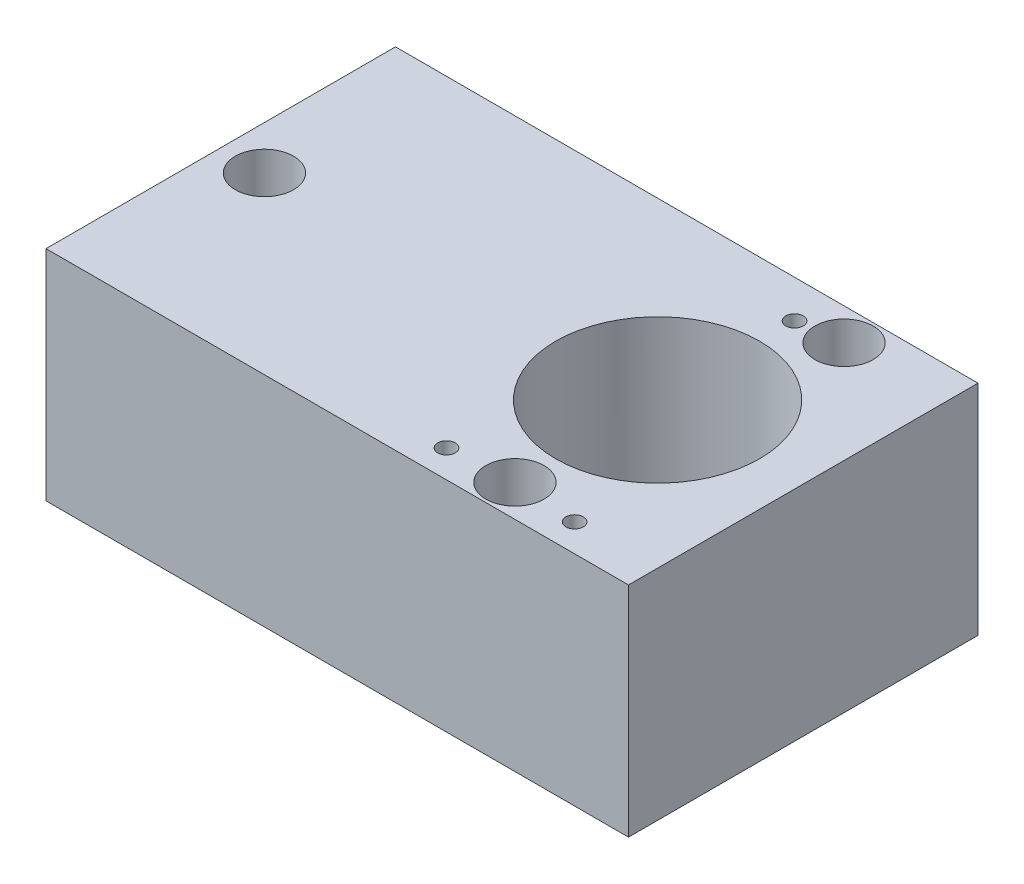
ISO-10303-21;
HEADER;
FILE_DESCRIPTION(('STEP AP214'),'2;1');
FILE_NAME('part.step','',(''),(''),'','','');
FILE_SCHEMA(('AUTOMOTIVE_DESIGN { 1 0 10303 214 1 1 1 1 }'));
ENDSEC;
DATA;
#1=APPLICATION_CONTEXT('core data for automotive mechanical design processes');
#2=APPLICATION_PROTOCOL_DEFINITION('international standard','automotive_design',2000,#1);
#3=PRODUCT_CONTEXT('',#1,'mechanical');
#4=PRODUCT('Part','Part','',(#3));
#5=PRODUCT_RELATED_PRODUCT_CATEGORY('part','',(#4));
#6=PRODUCT_DEFINITION_FORMATION('','',#4);
#7=PRODUCT_DEFINITION_CONTEXT('part definition',#1,'design');
#8=PRODUCT_DEFINITION('design','',#6,#7);
#9=PRODUCT_DEFINITION_SHAPE('','',#8);
#10=(LENGTH_UNIT() NAMED_UNIT(*) SI_UNIT(.MILLI.,.METRE.));
#11=(NAMED_UNIT(*) PLANE_ANGLE_UNIT() SI_UNIT($,.RADIAN.));
#12=(NAMED_UNIT(*) SI_UNIT($,.STERADIAN.) SOLID_ANGLE_UNIT());
#13=UNCERTAINTY_MEASURE_WITH_UNIT(LENGTH_MEASURE(1.E-05),#10,'distance_accuracy_value','');
#14=(GEOMETRIC_REPRESENTATION_CONTEXT(3) GLOBAL_UNCERTAINTY_ASSIGNED_CONTEXT((#13)) GLOBAL_UNIT_ASSIGNED_CONTEXT((#10,
#11,#12)) REPRESENTATION_CONTEXT('',''));
#15=CARTESIAN_POINT('',(0.,0.,0.));
#16=DIRECTION('',(0.,0.,1.));
#17=DIRECTION('',(1.,0.,0.));
#18=AXIS2_PLACEMENT_3D('',#15,#16,#17);
#19=CARTESIAN_POINT('',(0.,2.5,0.));
#20=DIRECTION('',(0.,-1.,0.));
#21=DIRECTION('',(0.,0.,-1.));
#22=AXIS2_PLACEMENT_3D('',#19,#20,#21);
#23=PLANE('',#22);
#24=CARTESIAN_POINT('',(15.,2.5,6.));
#25=DIRECTION('',(0.,1.,0.));
#26=DIRECTION('',(0.,0.,1.));
#27=AXIS2_PLACEMENT_3D('',#24,#25,#26);
#28=CIRCLE('',#27,1.25);
#29=CARTESIAN_POINT('',(15.,2.5,7.25));
#30=VERTEX_POINT('',#29);
#31=EDGE_CURVE('E144',#30,#30,#28,.T.);
#32=ORIENTED_EDGE('',*,*,#31,.F.);
#33=EDGE_LOOP('',(#32));
#34=FACE_BOUND('',#33,.T.);
#35=CARTESIAN_POINT('',(15.,2.5,6.));
#36=DIRECTION('',(0.,-1.,0.));
#37=DIRECTION('',(0.,0.,-1.));
#38=AXIS2_PLACEMENT_3D('',#35,#36,#37);
#39=CIRCLE('',#38,3.5);
#40=CARTESIAN_POINT('',(12.4398354279125,2.5,3.61346331186215));
#41=VERTEX_POINT('',#40);
#42=CARTESIAN_POINT('',(11.5051547803404,2.5,5.81011347961833));
#43=VERTEX_POINT('',#42);
#44=EDGE_CURVE('E13',#41,#43,#39,.T.);
#45=ORIENTED_EDGE('',*,*,#44,.F.);
#46=CARTESIAN_POINT('',(9.84707986243722,2.5,3.80741840382166));
#47=DIRECTION('',(0.,1.,0.));
#48=DIRECTION('',(0.,0.,1.));
#49=AXIS2_PLACEMENT_3D('',#46,#47,#48);
#50=CIRCLE('',#49,2.6);
#51=EDGE_CURVE('E134',#43,#41,#50,.T.);
#52=ORIENTED_EDGE('',*,*,#51,.F.);
#53=EDGE_LOOP('',(#45,#52));
#54=FACE_BOUND('',#53,.T.);
#55=ADVANCED_FACE('F54',(#34,#54),#23,.F.);
#56=CARTESIAN_POINT('',(0.,2.5,0.));
#57=DIRECTION('',(0.,0.,-1.));
#58=DIRECTION('',(-1.,0.,0.));
#59=AXIS2_PLACEMENT_3D('',#56,#57,#58);
#60=PLANE('',#59);
#61=DIRECTION('',(1.,0.,0.));
#62=VECTOR('',#61,1.);
#63=CARTESIAN_POINT('',(0.,0.,0.));
#64=LINE('',#63,#62);
#65=CARTESIAN_POINT('',(0.,0.,0.));
#66=VERTEX_POINT('',#65);
#67=CARTESIAN_POINT('',(20.,0.,0.));
#68=VERTEX_POINT('',#67);
#69=EDGE_CURVE('E149',#66,#68,#64,.T.);
#70=ORIENTED_EDGE('',*,*,#69,.F.);
#71=DIRECTION('',(0.,-1.,0.));
#72=VECTOR('',#71,1.);
#73=CARTESIAN_POINT('',(0.,2.5,0.));
#74=LINE('',#73,#72);
#75=CARTESIAN_POINT('',(0.,7.5,0.));
#76=VERTEX_POINT('',#75);
#77=EDGE_CURVE('E63',#76,#66,#74,.T.);
#78=ORIENTED_EDGE('',*,*,#77,.F.);
#79=DIRECTION('',(1.,0.,0.));
#80=VECTOR('',#79,1.);
#81=CARTESIAN_POINT('',(0.,7.5,0.));
#82=LINE('',#81,#80);
#83=CARTESIAN_POINT('',(20.,7.5,0.));
#84=VERTEX_POINT('',#83);
#85=EDGE_CURVE('E131',#76,#84,#82,.T.);
#86=ORIENTED_EDGE('',*,*,#85,.T.);
#87=DIRECTION('',(0.,-1.,0.));
#88=VECTOR('',#87,1.);
#89=CARTESIAN_POINT('',(20.,2.5,0.));
#90=LINE('',#89,#88);
#91=EDGE_CURVE('E113',#84,#68,#90,.T.);
#92=ORIENTED_EDGE('',*,*,#91,.T.);
#93=EDGE_LOOP('',(#70,#78,#86,#92));
#94=FACE_BOUND('',#93,.T.);
#95=ADVANCED_FACE('F56',(#94),#60,.T.);
#96=CARTESIAN_POINT('',(0.,2.5,0.));
#97=DIRECTION('',(1.,0.,0.));
#98=DIRECTION('',(0.,0.,-1.));
#99=AXIS2_PLACEMENT_3D('',#96,#97,#98);
#100=PLANE('',#99);
#101=DIRECTION('',(0.,0.,1.));
#102=VECTOR('',#101,1.);
#103=CARTESIAN_POINT('',(0.,0.,0.));
#104=LINE('',#103,#102);
#105=CARTESIAN_POINT('',(0.,0.,12.));
#106=VERTEX_POINT('',#105);
#107=EDGE_CURVE('E157',#66,#106,#104,.T.);
#108=ORIENTED_EDGE('',*,*,#107,.T.);
#109=DIRECTION('',(0.,-1.,0.));
#110=VECTOR('',#109,1.);
#111=CARTESIAN_POINT('',(0.,2.5,12.));
#112=LINE('',#111,#110);
#113=CARTESIAN_POINT('',(0.,7.5,12.));
#114=VERTEX_POINT('',#113);
#115=EDGE_CURVE('E112',#114,#106,#112,.T.);
#116=ORIENTED_EDGE('',*,*,#115,.F.);
#117=DIRECTION('',(0.,0.,1.));
#118=VECTOR('',#117,1.);
#119=CARTESIAN_POINT('',(0.,7.5,0.));
#120=LINE('',#119,#118);
#121=EDGE_CURVE('E122',#76,#114,#120,.T.);
#122=ORIENTED_EDGE('',*,*,#121,.F.);
#123=ORIENTED_EDGE('',*,*,#77,.T.);
#124=EDGE_LOOP('',(#108,#116,#122,#123));
#125=FACE_BOUND('',#124,.T.);
#126=ADVANCED_FACE('F263',(#125),#100,.F.);
#127=CARTESIAN_POINT('',(0.,2.5,12.));
#128=DIRECTION('',(0.,0.,-1.));
#129=DIRECTION('',(-1.,0.,0.));
#130=AXIS2_PLACEMENT_3D('',#127,#128,#129);
#131=PLANE('',#130);
#132=DIRECTION('',(1.,0.,0.));
#133=VECTOR('',#132,1.);
#134=CARTESIAN_POINT('',(0.,0.,12.));
#135=LINE('',#134,#133);
#136=CARTESIAN_POINT('',(20.,0.,12.));
#137=VERTEX_POINT('',#136);
#138=EDGE_CURVE('E107',#106,#137,#135,.T.);
#139=ORIENTED_EDGE('',*,*,#138,.T.);
#140=DIRECTION('',(0.,-1.,0.));
#141=VECTOR('',#140,1.);
#142=CARTESIAN_POINT('',(20.,2.5,12.));
#143=LINE('',#142,#141);
#144=CARTESIAN_POINT('',(20.,7.5,12.));
#145=VERTEX_POINT('',#144);
#146=EDGE_CURVE('E101',#145,#137,#143,.T.);
#147=ORIENTED_EDGE('',*,*,#146,.F.);
#148=DIRECTION('',(1.,0.,0.));
#149=VECTOR('',#148,1.);
#150=CARTESIAN_POINT('',(0.,7.5,12.));
#151=LINE('',#150,#149);
#152=EDGE_CURVE('E105',#114,#145,#151,.T.);
#153=ORIENTED_EDGE('',*,*,#152,.F.);
#154=ORIENTED_EDGE('',*,*,#115,.T.);
#155=EDGE_LOOP('',(#139,#147,#153,#154));
#156=FACE_BOUND('',#155,.T.);
#157=ADVANCED_FACE('F103',(#156),#131,.F.);
#158=CARTESIAN_POINT('',(20.,2.5,0.));
#159=DIRECTION('',(1.,0.,0.));
#160=DIRECTION('',(0.,0.,-1.));
#161=AXIS2_PLACEMENT_3D('',#158,#159,#160);
#162=PLANE('',#161);
#163=DIRECTION('',(0.,0.,1.));
#164=VECTOR('',#163,1.);
#165=CARTESIAN_POINT('',(20.,0.,0.));
#166=LINE('',#165,#164);
#167=EDGE_CURVE('E154',#68,#137,#166,.T.);
#168=ORIENTED_EDGE('',*,*,#167,.F.);
#169=ORIENTED_EDGE('',*,*,#91,.F.);
#170=DIRECTION('',(0.,0.,1.));
#171=VECTOR('',#170,1.);
#172=CARTESIAN_POINT('',(20.,7.5,0.));
#173=LINE('',#172,#171);
#174=EDGE_CURVE('E120',#84,#145,#173,.T.);
#175=ORIENTED_EDGE('',*,*,#174,.T.);
#176=ORIENTED_EDGE('',*,*,#146,.T.);
#177=EDGE_LOOP('',(#168,#169,#175,#176));
#178=FACE_BOUND('',#177,.T.);
#179=ADVANCED_FACE('F124',(#178),#162,.T.);
#180=CARTESIAN_POINT('',(0.,0.,0.));
#181=DIRECTION('',(0.,-1.,0.));
#182=DIRECTION('',(0.,0.,-1.));
#183=AXIS2_PLACEMENT_3D('',#180,#181,#182);
#184=PLANE('',#183);
#185=CARTESIAN_POINT('',(15.,0.,10.9));
#186=DIRECTION('',(0.,-1.,0.));
#187=DIRECTION('',(0.,0.,-1.));
#188=AXIS2_PLACEMENT_3D('',#185,#186,#187);
#189=CIRCLE('',#188,0.699999999999998);
#190=CARTESIAN_POINT('',(15.,0.,10.2));
#191=VERTEX_POINT('',#190);
#192=EDGE_CURVE('E179',#191,#191,#189,.T.);
#193=ORIENTED_EDGE('',*,*,#192,.F.);
#194=EDGE_LOOP('',(#193));
#195=FACE_BOUND('',#194,.T.);
#196=CARTESIAN_POINT('',(16.5,0.,1.1));
#197=DIRECTION('',(0.,-1.,0.));
#198=DIRECTION('',(0.,0.,-1.));
#199=AXIS2_PLACEMENT_3D('',#196,#197,#198);
#200=CIRCLE('',#199,0.699999999999998);
#201=CARTESIAN_POINT('',(16.5,0.,0.400000000000002));
#202=VERTEX_POINT('',#201);
#203=EDGE_CURVE('E174',#202,#202,#200,.T.);
#204=ORIENTED_EDGE('',*,*,#203,.F.);
#205=EDGE_LOOP('',(#204));
#206=FACE_BOUND('',#205,.T.);
#207=CARTESIAN_POINT('',(1.5,0.,6.));
#208=DIRECTION('',(0.,-1.,0.));
#209=DIRECTION('',(0.,0.,-1.));
#210=AXIS2_PLACEMENT_3D('',#207,#208,#209);
#211=CIRCLE('',#210,0.699999999999998);
#212=CARTESIAN_POINT('',(1.5,0.,5.3));
#213=VERTEX_POINT('',#212);
#214=EDGE_CURVE('E170',#213,#213,#211,.T.);
#215=ORIENTED_EDGE('',*,*,#214,.F.);
#216=EDGE_LOOP('',(#215));
#217=FACE_BOUND('',#216,.T.);
#218=CARTESIAN_POINT('',(9.84707986243722,0.,3.80741840382166));
#219=DIRECTION('',(0.,1.,0.));
#220=DIRECTION('',(0.,0.,1.));
#221=AXIS2_PLACEMENT_3D('',#218,#219,#220);
#222=CIRCLE('',#221,2.6);
#223=CARTESIAN_POINT('',(9.84707986243722,0.,6.40741840382166));
#224=VERTEX_POINT('',#223);
#225=EDGE_CURVE('E138',#224,#224,#222,.T.);
#226=ORIENTED_EDGE('',*,*,#225,.T.);
#227=EDGE_LOOP('',(#226));
#228=FACE_BOUND('',#227,.T.);
#229=CARTESIAN_POINT('',(15.,0.,6.));
#230=DIRECTION('',(0.,1.,0.));
#231=DIRECTION('',(0.,0.,1.));
#232=AXIS2_PLACEMENT_3D('',#229,#230,#231);
#233=CIRCLE('',#232,1.25);
#234=CARTESIAN_POINT('',(15.,0.,7.25));
#235=VERTEX_POINT('',#234);
#236=EDGE_CURVE('E141',#235,#235,#233,.T.);
#237=ORIENTED_EDGE('',*,*,#236,.T.);
#238=EDGE_LOOP('',(#237));
#239=FACE_BOUND('',#238,.T.);
#240=CARTESIAN_POINT('',(7.67873609357973,0.,8.97058461265678));
#241=DIRECTION('',(0.,1.,0.));
#242=DIRECTION('',(0.,0.,1.));
#243=AXIS2_PLACEMENT_3D('',#240,#241,#242);
#244=CIRCLE('',#243,0.500000000000001);
#245=CARTESIAN_POINT('',(7.67873609357973,0.,9.47058461265678));
#246=VERTEX_POINT('',#245);
#247=EDGE_CURVE('E136',#246,#246,#244,.T.);
#248=ORIENTED_EDGE('',*,*,#247,.T.);
#249=EDGE_LOOP('',(#248));
#250=FACE_BOUND('',#249,.T.);
#251=ORIENTED_EDGE('',*,*,#69,.T.);
#252=ORIENTED_EDGE('',*,*,#167,.T.);
#253=ORIENTED_EDGE('',*,*,#138,.F.);
#254=ORIENTED_EDGE('',*,*,#107,.F.);
#255=EDGE_LOOP('',(#251,#252,#253,#254));
#256=FACE_BOUND('',#255,.T.);
#257=ADVANCED_FACE('F270',(#195,#206,#217,#228,#239,#250,#256),#184,.T.);
#258=CARTESIAN_POINT('',(7.67873609357973,3.,8.97058461265678));
#259=DIRECTION('',(0.,-1.,0.));
#260=DIRECTION('',(0.,0.,-1.));
#261=AXIS2_PLACEMENT_3D('',#258,#259,#260);
#262=CYLINDRICAL_SURFACE('',#261,0.500000000000001);
#263=ORIENTED_EDGE('',*,*,#247,.F.);
#264=EDGE_LOOP('',(#263));
#265=FACE_BOUND('',#264,.T.);
#266=CARTESIAN_POINT('',(7.67873609357973,2.5,8.97058461265678));
#267=DIRECTION('',(0.,-1.,0.));
#268=DIRECTION('',(0.,0.,-1.));
#269=AXIS2_PLACEMENT_3D('',#266,#267,#268);
#270=CIRCLE('',#269,0.500000000000001);
#271=CARTESIAN_POINT('',(7.67873609357973,2.5,8.47058461265678));
#272=VERTEX_POINT('',#271);
#273=EDGE_CURVE('E133',#272,#272,#270,.F.);
#274=ORIENTED_EDGE('',*,*,#273,.T.);
#275=EDGE_LOOP('',(#274));
#276=FACE_BOUND('',#275,.T.);
#277=ADVANCED_FACE('F268',(#265,#276),#262,.F.);
#278=CARTESIAN_POINT('',(15.,2.5,6.));
#279=DIRECTION('',(0.,-1.,0.));
#280=DIRECTION('',(0.,0.,-1.));
#281=AXIS2_PLACEMENT_3D('',#278,#279,#280);
#282=CYLINDRICAL_SURFACE('',#281,1.25);
#283=ORIENTED_EDGE('',*,*,#31,.T.);
#284=EDGE_LOOP('',(#283));
#285=FACE_BOUND('',#284,.T.);
#286=ORIENTED_EDGE('',*,*,#236,.F.);
#287=EDGE_LOOP('',(#286));
#288=FACE_BOUND('',#287,.T.);
#289=ADVANCED_FACE('F295',(#285,#288),#282,.F.);
#290=CARTESIAN_POINT('',(9.84707986243722,2.5,3.80741840382166));
#291=DIRECTION('',(0.,-1.,0.));
#292=DIRECTION('',(0.,0.,-1.));
#293=AXIS2_PLACEMENT_3D('',#290,#291,#292);
#294=CYLINDRICAL_SURFACE('',#293,2.6);
#295=ORIENTED_EDGE('',*,*,#51,.T.);
#296=EDGE_CURVE('E137',#41,#43,#50,.T.);
#297=ORIENTED_EDGE('',*,*,#296,.T.);
#298=EDGE_LOOP('',(#295,#297));
#299=FACE_BOUND('',#298,.T.);
#300=ORIENTED_EDGE('',*,*,#225,.F.);
#301=EDGE_LOOP('',(#300));
#302=FACE_BOUND('',#301,.T.);
#303=ADVANCED_FACE('F248',(#299,#302),#294,.F.);
#304=CARTESIAN_POINT('',(15.,7.5,6.));
#305=DIRECTION('',(0.,-1.,0.));
#306=DIRECTION('',(0.,0.,-1.));
#307=AXIS2_PLACEMENT_3D('',#304,#305,#306);
#308=CYLINDRICAL_SURFACE('',#307,3.5);
#309=CARTESIAN_POINT('',(15.,7.5,6.));
#310=DIRECTION('',(0.,-1.,0.));
#311=DIRECTION('',(0.,0.,-1.));
#312=AXIS2_PLACEMENT_3D('',#309,#310,#311);
#313=CIRCLE('',#312,3.5);
#314=CARTESIAN_POINT('',(15.,7.5,2.5));
#315=VERTEX_POINT('',#314);
#316=EDGE_CURVE('E125',#315,#315,#313,.T.);
#317=ORIENTED_EDGE('',*,*,#316,.F.);
#318=EDGE_LOOP('',(#317));
#319=FACE_BOUND('',#318,.T.);
#320=EDGE_CURVE('E65',#43,#41,#39,.T.);
#321=ORIENTED_EDGE('',*,*,#320,.T.);
#322=ORIENTED_EDGE('',*,*,#44,.T.);
#323=EDGE_LOOP('',(#321,#322));
#324=FACE_BOUND('',#323,.T.);
#325=ADVANCED_FACE('F232',(#319,#324),#308,.F.);
#326=CARTESIAN_POINT('',(0.,7.5,0.));
#327=DIRECTION('',(0.,1.,0.));
#328=DIRECTION('',(0.,0.,1.));
#329=AXIS2_PLACEMENT_3D('',#326,#327,#328);
#330=PLANE('',#329);
#331=CARTESIAN_POINT('',(12.8,7.5,11.05));
#332=DIRECTION('',(0.,1.,0.));
#333=DIRECTION('',(0.,0.,1.));
#334=AXIS2_PLACEMENT_3D('',#331,#332,#333);
#335=CIRCLE('',#334,0.3);
#336=CARTESIAN_POINT('',(12.8,7.5,11.35));
#337=VERTEX_POINT('',#336);
#338=EDGE_CURVE('E214',#337,#337,#335,.T.);
#339=ORIENTED_EDGE('',*,*,#338,.F.);
#340=EDGE_LOOP('',(#339));
#341=FACE_BOUND('',#340,.T.);
#342=CARTESIAN_POINT('',(17.2,7.5,11.05));
#343=DIRECTION('',(0.,1.,0.));
#344=DIRECTION('',(0.,0.,1.));
#345=AXIS2_PLACEMENT_3D('',#342,#343,#344);
#346=CIRCLE('',#345,0.299999999999997);
#347=CARTESIAN_POINT('',(17.2,7.5,11.35));
#348=VERTEX_POINT('',#347);
#349=EDGE_CURVE('E211',#348,#348,#346,.T.);
#350=ORIENTED_EDGE('',*,*,#349,.F.);
#351=EDGE_LOOP('',(#350));
#352=FACE_BOUND('',#351,.T.);
#353=CARTESIAN_POINT('',(15.,7.5,1.3));
#354=DIRECTION('',(0.,1.,0.));
#355=DIRECTION('',(0.,0.,1.));
#356=AXIS2_PLACEMENT_3D('',#353,#354,#355);
#357=CIRCLE('',#356,0.3);
#358=CARTESIAN_POINT('',(15.,7.5,1.6));
#359=VERTEX_POINT('',#358);
#360=EDGE_CURVE('E205',#359,#359,#357,.T.);
#361=ORIENTED_EDGE('',*,*,#360,.F.);
#362=EDGE_LOOP('',(#361));
#363=FACE_BOUND('',#362,.T.);
#364=CARTESIAN_POINT('',(15.,7.5,10.9));
#365=DIRECTION('',(0.,1.,0.));
#366=DIRECTION('',(0.,0.,1.));
#367=AXIS2_PLACEMENT_3D('',#364,#365,#366);
#368=CIRCLE('',#367,1.);
#369=CARTESIAN_POINT('',(15.,7.5,11.9));
#370=VERTEX_POINT('',#369);
#371=EDGE_CURVE('E195',#370,#370,#368,.T.);
#372=ORIENTED_EDGE('',*,*,#371,.F.);
#373=EDGE_LOOP('',(#372));
#374=FACE_BOUND('',#373,.T.);
#375=CARTESIAN_POINT('',(1.5,7.5,6.));
#376=DIRECTION('',(0.,1.,0.));
#377=DIRECTION('',(0.,0.,1.));
#378=AXIS2_PLACEMENT_3D('',#375,#376,#377);
#379=CIRCLE('',#378,1.);
#380=CARTESIAN_POINT('',(1.5,7.5,7.));
#381=VERTEX_POINT('',#380);
#382=EDGE_CURVE('E192',#381,#381,#379,.T.);
#383=ORIENTED_EDGE('',*,*,#382,.F.);
#384=EDGE_LOOP('',(#383));
#385=FACE_BOUND('',#384,.T.);
#386=CARTESIAN_POINT('',(16.5,7.5,1.1));
#387=DIRECTION('',(0.,1.,0.));
#388=DIRECTION('',(0.,0.,1.));
#389=AXIS2_PLACEMENT_3D('',#386,#387,#388);
#390=CIRCLE('',#389,1.);
#391=CARTESIAN_POINT('',(16.5,7.5,2.1));
#392=VERTEX_POINT('',#391);
#393=EDGE_CURVE('E184',#392,#392,#390,.T.);
#394=ORIENTED_EDGE('',*,*,#393,.F.);
#395=EDGE_LOOP('',(#394));
#396=FACE_BOUND('',#395,.T.);
#397=ORIENTED_EDGE('',*,*,#316,.T.);
#398=EDGE_LOOP('',(#397));
#399=FACE_BOUND('',#398,.T.);
#400=ORIENTED_EDGE('',*,*,#174,.F.);
#401=ORIENTED_EDGE('',*,*,#85,.F.);
#402=ORIENTED_EDGE('',*,*,#121,.T.);
#403=ORIENTED_EDGE('',*,*,#152,.T.);
#404=EDGE_LOOP('',(#400,#401,#402,#403));
#405=FACE_BOUND('',#404,.T.);
#406=ADVANCED_FACE('F118',(#341,#352,#363,#374,#385,#396,#399,#405),#330,.T.);
#407=CARTESIAN_POINT('',(0.,2.5,0.));
#408=DIRECTION('',(0.,1.,0.));
#409=DIRECTION('',(0.,0.,1.));
#410=AXIS2_PLACEMENT_3D('',#407,#408,#409);
#411=PLANE('',#410);
#412=ORIENTED_EDGE('',*,*,#296,.F.);
#413=ORIENTED_EDGE('',*,*,#320,.F.);
#414=EDGE_LOOP('',(#412,#413));
#415=FACE_BOUND('',#414,.T.);
#416=ADVANCED_FACE('F231',(#415),#411,.F.);
#417=ORIENTED_EDGE('',*,*,#273,.F.);
#418=EDGE_LOOP('',(#417));
#419=FACE_BOUND('',#418,.T.);
#420=ADVANCED_FACE('F323',(#419),#411,.F.);
#421=CARTESIAN_POINT('',(1.5,7.5,6.));
#422=DIRECTION('',(0.,-1.,0.));
#423=DIRECTION('',(0.,0.,-1.));
#424=AXIS2_PLACEMENT_3D('',#421,#422,#423);
#425=CYLINDRICAL_SURFACE('',#424,0.699999999999998);
#426=CARTESIAN_POINT('',(1.5,2.,6.));
#427=DIRECTION('',(0.,-1.,0.));
#428=DIRECTION('',(0.,0.,-1.));
#429=AXIS2_PLACEMENT_3D('',#426,#427,#428);
#430=CIRCLE('',#429,0.699999999999998);
#431=CARTESIAN_POINT('',(1.5,2.,5.3));
#432=VERTEX_POINT('',#431);
#433=EDGE_CURVE('E58',#432,#432,#430,.F.);
#434=ORIENTED_EDGE('',*,*,#433,.T.);
#435=EDGE_LOOP('',(#434));
#436=FACE_BOUND('',#435,.T.);
#437=ORIENTED_EDGE('',*,*,#214,.T.);
#438=EDGE_LOOP('',(#437));
#439=FACE_BOUND('',#438,.T.);
#440=ADVANCED_FACE('F329',(#436,#439),#425,.F.);
#441=CARTESIAN_POINT('',(16.5,7.5,1.1));
#442=DIRECTION('',(0.,-1.,0.));
#443=DIRECTION('',(0.,0.,-1.));
#444=AXIS2_PLACEMENT_3D('',#441,#442,#443);
#445=CYLINDRICAL_SURFACE('',#444,0.699999999999998);
#446=CARTESIAN_POINT('',(16.5,2.,1.1));
#447=DIRECTION('',(0.,-1.,0.));
#448=DIRECTION('',(0.,0.,-1.));
#449=AXIS2_PLACEMENT_3D('',#446,#447,#448);
#450=CIRCLE('',#449,0.699999999999998);
#451=CARTESIAN_POINT('',(16.5,2.,0.400000000000002));
#452=VERTEX_POINT('',#451);
#453=EDGE_CURVE('E164',#452,#452,#450,.F.);
#454=ORIENTED_EDGE('',*,*,#453,.T.);
#455=EDGE_LOOP('',(#454));
#456=FACE_BOUND('',#455,.T.);
#457=ORIENTED_EDGE('',*,*,#203,.T.);
#458=EDGE_LOOP('',(#457));
#459=FACE_BOUND('',#458,.T.);
#460=ADVANCED_FACE('F335',(#456,#459),#445,.F.);
#461=CARTESIAN_POINT('',(15.,7.5,10.9));
#462=DIRECTION('',(0.,-1.,0.));
#463=DIRECTION('',(0.,0.,-1.));
#464=AXIS2_PLACEMENT_3D('',#461,#462,#463);
#465=CYLINDRICAL_SURFACE('',#464,0.699999999999998);
#466=CARTESIAN_POINT('',(15.,2.,10.9));
#467=DIRECTION('',(0.,-1.,0.));
#468=DIRECTION('',(0.,0.,-1.));
#469=AXIS2_PLACEMENT_3D('',#466,#467,#468);
#470=CIRCLE('',#469,0.699999999999998);
#471=CARTESIAN_POINT('',(15.,2.,10.2));
#472=VERTEX_POINT('',#471);
#473=EDGE_CURVE('E162',#472,#472,#470,.F.);
#474=ORIENTED_EDGE('',*,*,#473,.T.);
#475=EDGE_LOOP('',(#474));
#476=FACE_BOUND('',#475,.T.);
#477=ORIENTED_EDGE('',*,*,#192,.T.);
#478=EDGE_LOOP('',(#477));
#479=FACE_BOUND('',#478,.T.);
#480=ADVANCED_FACE('F342',(#476,#479),#465,.F.);
#481=CARTESIAN_POINT('',(0.,2.,0.));
#482=DIRECTION('',(0.,-1.,0.));
#483=DIRECTION('',(0.,0.,-1.));
#484=AXIS2_PLACEMENT_3D('',#481,#482,#483);
#485=PLANE('',#484);
#486=CARTESIAN_POINT('',(15.,2.,10.9));
#487=DIRECTION('',(0.,-1.,0.));
#488=DIRECTION('',(0.,0.,-1.));
#489=AXIS2_PLACEMENT_3D('',#486,#487,#488);
#490=CIRCLE('',#489,1.);
#491=CARTESIAN_POINT('',(15.,2.,9.9));
#492=VERTEX_POINT('',#491);
#493=EDGE_CURVE('E165',#492,#492,#490,.F.);
#494=ORIENTED_EDGE('',*,*,#493,.T.);
#495=EDGE_LOOP('',(#494));
#496=FACE_BOUND('',#495,.T.);
#497=ORIENTED_EDGE('',*,*,#473,.F.);
#498=EDGE_LOOP('',(#497));
#499=FACE_BOUND('',#498,.T.);
#500=ADVANCED_FACE('F349',(#496,#499),#485,.F.);
#501=CARTESIAN_POINT('',(15.,-2.8284271247462,10.9));
#502=DIRECTION('',(0.,1.,0.));
#503=DIRECTION('',(0.,0.,1.));
#504=AXIS2_PLACEMENT_3D('',#501,#502,#503);
#505=CYLINDRICAL_SURFACE('',#504,1.);
#506=ORIENTED_EDGE('',*,*,#371,.T.);
#507=EDGE_LOOP('',(#506));
#508=FACE_BOUND('',#507,.T.);
#509=ORIENTED_EDGE('',*,*,#493,.F.);
#510=EDGE_LOOP('',(#509));
#511=FACE_BOUND('',#510,.T.);
#512=ADVANCED_FACE('F357',(#508,#511),#505,.F.);
#513=CARTESIAN_POINT('',(0.,2.,0.));
#514=DIRECTION('',(0.,-1.,0.));
#515=DIRECTION('',(0.,0.,-1.));
#516=AXIS2_PLACEMENT_3D('',#513,#514,#515);
#517=PLANE('',#516);
#518=CARTESIAN_POINT('',(16.5,2.,1.1));
#519=DIRECTION('',(0.,-1.,0.));
#520=DIRECTION('',(0.,0.,-1.));
#521=AXIS2_PLACEMENT_3D('',#518,#519,#520);
#522=CIRCLE('',#521,1.);
#523=CARTESIAN_POINT('',(16.5,2.,0.0999999999999987));
#524=VERTEX_POINT('',#523);
#525=EDGE_CURVE('E188',#524,#524,#522,.F.);
#526=ORIENTED_EDGE('',*,*,#525,.T.);
#527=EDGE_LOOP('',(#526));
#528=FACE_BOUND('',#527,.T.);
#529=ORIENTED_EDGE('',*,*,#453,.F.);
#530=EDGE_LOOP('',(#529));
#531=FACE_BOUND('',#530,.T.);
#532=ADVANCED_FACE('F365',(#528,#531),#517,.F.);
#533=CARTESIAN_POINT('',(16.5,-2.8284271247462,1.1));
#534=DIRECTION('',(0.,1.,0.));
#535=DIRECTION('',(0.,0.,1.));
#536=AXIS2_PLACEMENT_3D('',#533,#534,#535);
#537=CYLINDRICAL_SURFACE('',#536,1.);
#538=ORIENTED_EDGE('',*,*,#393,.T.);
#539=EDGE_LOOP('',(#538));
#540=FACE_BOUND('',#539,.T.);
#541=ORIENTED_EDGE('',*,*,#525,.F.);
#542=EDGE_LOOP('',(#541));
#543=FACE_BOUND('',#542,.T.);
#544=ADVANCED_FACE('F373',(#540,#543),#537,.F.);
#545=CARTESIAN_POINT('',(0.,2.,0.));
#546=DIRECTION('',(0.,-1.,0.));
#547=DIRECTION('',(0.,0.,-1.));
#548=AXIS2_PLACEMENT_3D('',#545,#546,#547);
#549=PLANE('',#548);
#550=CARTESIAN_POINT('',(1.5,2.,6.));
#551=DIRECTION('',(0.,-1.,0.));
#552=DIRECTION('',(0.,0.,-1.));
#553=AXIS2_PLACEMENT_3D('',#550,#551,#552);
#554=CIRCLE('',#553,1.);
#555=CARTESIAN_POINT('',(1.5,2.,5.));
#556=VERTEX_POINT('',#555);
#557=EDGE_CURVE('E187',#556,#556,#554,.F.);
#558=ORIENTED_EDGE('',*,*,#557,.T.);
#559=EDGE_LOOP('',(#558));
#560=FACE_BOUND('',#559,.T.);
#561=ORIENTED_EDGE('',*,*,#433,.F.);
#562=EDGE_LOOP('',(#561));
#563=FACE_BOUND('',#562,.T.);
#564=ADVANCED_FACE('F381',(#560,#563),#549,.F.);
#565=CARTESIAN_POINT('',(1.5,-2.8284271247462,6.));
#566=DIRECTION('',(0.,1.,0.));
#567=DIRECTION('',(0.,0.,1.));
#568=AXIS2_PLACEMENT_3D('',#565,#566,#567);
#569=CYLINDRICAL_SURFACE('',#568,1.);
#570=ORIENTED_EDGE('',*,*,#382,.T.);
#571=EDGE_LOOP('',(#570));
#572=FACE_BOUND('',#571,.T.);
#573=ORIENTED_EDGE('',*,*,#557,.F.);
#574=EDGE_LOOP('',(#573));
#575=FACE_BOUND('',#574,.T.);
#576=ADVANCED_FACE('F389',(#572,#575),#569,.F.);
#577=CARTESIAN_POINT('',(15.,1.5,1.3));
#578=DIRECTION('',(0.,1.,0.));
#579=DIRECTION('',(0.,0.,1.));
#580=AXIS2_PLACEMENT_3D('',#577,#578,#579);
#581=CYLINDRICAL_SURFACE('',#580,0.3);
#582=CARTESIAN_POINT('',(15.,1.5,1.3));
#583=DIRECTION('',(0.,1.,0.));
#584=DIRECTION('',(0.,0.,1.));
#585=AXIS2_PLACEMENT_3D('',#582,#583,#584);
#586=CIRCLE('',#585,0.3);
#587=CARTESIAN_POINT('',(15.,1.5,1.6));
#588=VERTEX_POINT('',#587);
#589=EDGE_CURVE('E202',#588,#588,#586,.T.);
#590=ORIENTED_EDGE('',*,*,#589,.F.);
#591=EDGE_LOOP('',(#590));
#592=FACE_BOUND('',#591,.T.);
#593=ORIENTED_EDGE('',*,*,#360,.T.);
#594=EDGE_LOOP('',(#593));
#595=FACE_BOUND('',#594,.T.);
#596=ADVANCED_FACE('F396',(#592,#595),#581,.F.);
#597=CARTESIAN_POINT('',(15.,1.5,1.3));
#598=DIRECTION('',(0.,1.,0.));
#599=DIRECTION('',(0.,0.,1.));
#600=AXIS2_PLACEMENT_3D('',#597,#598,#599);
#601=PLANE('',#600);
#602=ORIENTED_EDGE('',*,*,#589,.T.);
#603=EDGE_LOOP('',(#602));
#604=FACE_BOUND('',#603,.T.);
#605=ADVANCED_FACE('F403',(#604),#601,.T.);
#606=CARTESIAN_POINT('',(17.2,1.5,11.05));
#607=DIRECTION('',(0.,1.,0.));
#608=DIRECTION('',(0.,0.,1.));
#609=AXIS2_PLACEMENT_3D('',#606,#607,#608);
#610=CYLINDRICAL_SURFACE('',#609,0.299999999999997);
#611=CARTESIAN_POINT('',(17.2,1.5,11.05));
#612=DIRECTION('',(0.,1.,0.));
#613=DIRECTION('',(0.,0.,1.));
#614=AXIS2_PLACEMENT_3D('',#611,#612,#613);
#615=CIRCLE('',#614,0.299999999999997);
#616=CARTESIAN_POINT('',(17.2,1.5,11.35));
#617=VERTEX_POINT('',#616);
#618=EDGE_CURVE('E208',#617,#617,#615,.T.);
#619=ORIENTED_EDGE('',*,*,#618,.F.);
#620=EDGE_LOOP('',(#619));
#621=FACE_BOUND('',#620,.T.);
#622=ORIENTED_EDGE('',*,*,#349,.T.);
#623=EDGE_LOOP('',(#622));
#624=FACE_BOUND('',#623,.T.);
#625=ADVANCED_FACE('F411',(#621,#624),#610,.F.);
#626=CARTESIAN_POINT('',(17.2,1.5,11.05));
#627=DIRECTION('',(0.,1.,0.));
#628=DIRECTION('',(0.,0.,1.));
#629=AXIS2_PLACEMENT_3D('',#626,#627,#628);
#630=PLANE('',#629);
#631=ORIENTED_EDGE('',*,*,#618,.T.);
#632=EDGE_LOOP('',(#631));
#633=FACE_BOUND('',#632,.T.);
#634=ADVANCED_FACE('F225',(#633),#630,.T.);
#635=CARTESIAN_POINT('',(12.8,1.5,11.05));
#636=DIRECTION('',(0.,1.,0.));
#637=DIRECTION('',(0.,0.,1.));
#638=AXIS2_PLACEMENT_3D('',#635,#636,#637);
#639=CYLINDRICAL_SURFACE('',#638,0.3);
#640=CARTESIAN_POINT('',(12.8,1.5,11.05));
#641=DIRECTION('',(0.,1.,0.));
#642=DIRECTION('',(0.,0.,1.));
#643=AXIS2_PLACEMENT_3D('',#640,#641,#642);
#644=CIRCLE('',#643,0.3);
#645=CARTESIAN_POINT('',(12.8,1.5,11.35));
#646=VERTEX_POINT('',#645);
#647=EDGE_CURVE('E191',#646,#646,#644,.T.);
#648=ORIENTED_EDGE('',*,*,#647,.F.);
#649=EDGE_LOOP('',(#648));
#650=FACE_BOUND('',#649,.T.);
#651=ORIENTED_EDGE('',*,*,#338,.T.);
#652=EDGE_LOOP('',(#651));
#653=FACE_BOUND('',#652,.T.);
#654=ADVANCED_FACE('F222',(#650,#653),#639,.F.);
#655=CARTESIAN_POINT('',(12.8,1.5,11.05));
#656=DIRECTION('',(0.,1.,0.));
#657=DIRECTION('',(0.,0.,1.));
#658=AXIS2_PLACEMENT_3D('',#655,#656,#657);
#659=PLANE('',#658);
#660=ORIENTED_EDGE('',*,*,#647,.T.);
#661=EDGE_LOOP('',(#660));
#662=FACE_BOUND('',#661,.T.);
#663=ADVANCED_FACE('F220',(#662),#659,.T.);
#664=CLOSED_SHELL('',(#55,#95,#126,#157,#179,#257,#277,#289,#303,#325,#406,#416,#420,#440,#460,
#480,#500,#512,#532,#544,#564,#576,#596,#605,#625,#634,#654,#663));
#665=MANIFOLD_SOLID_BREP('B2',#664);
#666=ADVANCED_BREP_SHAPE_REPRESENTATION('',(#18,#665),#14);
#667=SHAPE_DEFINITION_REPRESENTATION(#9,#666);
ENDSEC;
END-ISO-10303-21;
